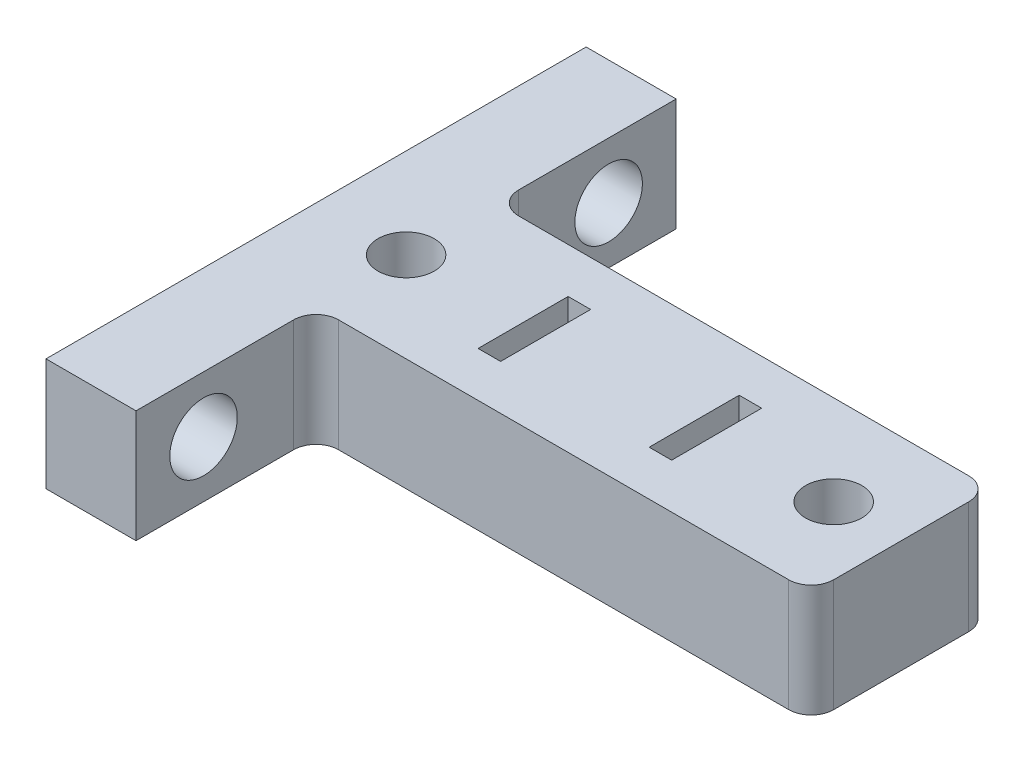
ISO-10303-21;
HEADER;
FILE_DESCRIPTION(('STEP AP214'),'2;1');
FILE_NAME('part.step','',(''),(''),'','','');
FILE_SCHEMA(('AUTOMOTIVE_DESIGN { 1 0 10303 214 1 1 1 1 }'));
ENDSEC;
DATA;
#1=APPLICATION_CONTEXT('core data for automotive mechanical design processes');
#2=APPLICATION_PROTOCOL_DEFINITION('international standard','automotive_design',2000,#1);
#3=PRODUCT_CONTEXT('',#1,'mechanical');
#4=PRODUCT('Part','Part','',(#3));
#5=PRODUCT_RELATED_PRODUCT_CATEGORY('part','',(#4));
#6=PRODUCT_DEFINITION_FORMATION('','',#4);
#7=PRODUCT_DEFINITION_CONTEXT('part definition',#1,'design');
#8=PRODUCT_DEFINITION('design','',#6,#7);
#9=PRODUCT_DEFINITION_SHAPE('','',#8);
#10=(LENGTH_UNIT() NAMED_UNIT(*) SI_UNIT(.MILLI.,.METRE.));
#11=(NAMED_UNIT(*) PLANE_ANGLE_UNIT() SI_UNIT($,.RADIAN.));
#12=(NAMED_UNIT(*) SI_UNIT($,.STERADIAN.) SOLID_ANGLE_UNIT());
#13=UNCERTAINTY_MEASURE_WITH_UNIT(LENGTH_MEASURE(1.E-05),#10,'distance_accuracy_value','');
#14=(GEOMETRIC_REPRESENTATION_CONTEXT(3) GLOBAL_UNCERTAINTY_ASSIGNED_CONTEXT((#13)) GLOBAL_UNIT_ASSIGNED_CONTEXT((#10,
#11,#12)) REPRESENTATION_CONTEXT('',''));
#15=CARTESIAN_POINT('',(0.,0.,0.));
#16=DIRECTION('',(0.,0.,1.));
#17=DIRECTION('',(1.,0.,0.));
#18=AXIS2_PLACEMENT_3D('',#15,#16,#17);
#19=CARTESIAN_POINT('',(-8.,5.,-5.));
#20=DIRECTION('',(0.,1.,0.));
#21=DIRECTION('',(0.,0.,1.));
#22=AXIS2_PLACEMENT_3D('',#19,#20,#21);
#23=PLANE('',#22);
#24=CARTESIAN_POINT('',(10.,5.,0.));
#25=DIRECTION('',(0.,1.,0.));
#26=DIRECTION('',(0.,0.,1.));
#27=AXIS2_PLACEMENT_3D('',#24,#25,#26);
#28=CIRCLE('',#27,1.25);
#29=CARTESIAN_POINT('',(10.,5.,1.25));
#30=VERTEX_POINT('',#29);
#31=EDGE_CURVE('E245',#30,#30,#28,.T.);
#32=ORIENTED_EDGE('',*,*,#31,.F.);
#33=EDGE_LOOP('',(#32));
#34=FACE_BOUND('',#33,.T.);
#35=DIRECTION('',(0.,0.,1.));
#36=VECTOR('',#35,1.);
#37=CARTESIAN_POINT('',(-13.,5.,-4.));
#38=LINE('',#37,#36);
#39=CARTESIAN_POINT('',(-13.,5.,-12.));
#40=VERTEX_POINT('',#39);
#41=CARTESIAN_POINT('',(-13.,5.,12.));
#42=VERTEX_POINT('',#41);
#43=EDGE_CURVE('E251',#40,#42,#38,.T.);
#44=ORIENTED_EDGE('',*,*,#43,.T.);
#45=DIRECTION('',(1.,0.,0.));
#46=VECTOR('',#45,1.);
#47=CARTESIAN_POINT('',(-13.,5.,12.));
#48=LINE('',#47,#46);
#49=CARTESIAN_POINT('',(-9.,5.,12.));
#50=VERTEX_POINT('',#49);
#51=EDGE_CURVE('E253',#42,#50,#48,.T.);
#52=ORIENTED_EDGE('',*,*,#51,.T.);
#53=DIRECTION('',(0.,0.,-1.));
#54=VECTOR('',#53,1.);
#55=CARTESIAN_POINT('',(-9.,5.,12.));
#56=LINE('',#55,#54);
#57=CARTESIAN_POINT('',(-9.,5.,5.));
#58=VERTEX_POINT('',#57);
#59=EDGE_CURVE('E256',#50,#58,#56,.T.);
#60=ORIENTED_EDGE('',*,*,#59,.T.);
#61=CARTESIAN_POINT('',(-8.,5.,5.));
#62=DIRECTION('',(0.,-1.,0.));
#63=DIRECTION('',(0.,0.,-1.));
#64=AXIS2_PLACEMENT_3D('',#61,#62,#63);
#65=CIRCLE('',#64,1.);
#66=CARTESIAN_POINT('',(-8.,5.,4.));
#67=VERTEX_POINT('',#66);
#68=EDGE_CURVE('E258',#58,#67,#65,.T.);
#69=ORIENTED_EDGE('',*,*,#68,.T.);
#70=DIRECTION('',(1.,0.,0.));
#71=VECTOR('',#70,1.);
#72=CARTESIAN_POINT('',(-8.,5.,4.));
#73=LINE('',#72,#71);
#74=CARTESIAN_POINT('',(12.,5.,4.));
#75=VERTEX_POINT('',#74);
#76=EDGE_CURVE('E260',#67,#75,#73,.T.);
#77=ORIENTED_EDGE('',*,*,#76,.T.);
#78=CARTESIAN_POINT('',(12.,5.,3.));
#79=DIRECTION('',(0.,1.,0.));
#80=DIRECTION('',(0.,0.,1.));
#81=AXIS2_PLACEMENT_3D('',#78,#79,#80);
#82=CIRCLE('',#81,1.);
#83=CARTESIAN_POINT('',(13.,5.,3.));
#84=VERTEX_POINT('',#83);
#85=EDGE_CURVE('E262',#75,#84,#82,.T.);
#86=ORIENTED_EDGE('',*,*,#85,.T.);
#87=DIRECTION('',(0.,0.,-1.));
#88=VECTOR('',#87,1.);
#89=CARTESIAN_POINT('',(13.,5.,-3.));
#90=LINE('',#89,#88);
#91=CARTESIAN_POINT('',(13.,5.,-3.));
#92=VERTEX_POINT('',#91);
#93=EDGE_CURVE('E264',#84,#92,#90,.T.);
#94=ORIENTED_EDGE('',*,*,#93,.T.);
#95=CARTESIAN_POINT('',(12.,5.,-3.));
#96=DIRECTION('',(0.,1.,0.));
#97=DIRECTION('',(0.,0.,1.));
#98=AXIS2_PLACEMENT_3D('',#95,#96,#97);
#99=CIRCLE('',#98,0.999999999999999);
#100=CARTESIAN_POINT('',(12.,5.,-4.));
#101=VERTEX_POINT('',#100);
#102=EDGE_CURVE('E266',#92,#101,#99,.T.);
#103=ORIENTED_EDGE('',*,*,#102,.T.);
#104=DIRECTION('',(-1.,0.,0.));
#105=VECTOR('',#104,1.);
#106=CARTESIAN_POINT('',(-8.,5.,-4.));
#107=LINE('',#106,#105);
#108=CARTESIAN_POINT('',(-8.,5.,-4.));
#109=VERTEX_POINT('',#108);
#110=EDGE_CURVE('E268',#101,#109,#107,.T.);
#111=ORIENTED_EDGE('',*,*,#110,.T.);
#112=CARTESIAN_POINT('',(-8.,5.,-5.));
#113=DIRECTION('',(0.,-1.,0.));
#114=DIRECTION('',(0.,0.,1.));
#115=AXIS2_PLACEMENT_3D('',#112,#113,#114);
#116=CIRCLE('',#115,0.999999999999999);
#117=CARTESIAN_POINT('',(-9.,5.,-5.));
#118=VERTEX_POINT('',#117);
#119=EDGE_CURVE('E270',#109,#118,#116,.T.);
#120=ORIENTED_EDGE('',*,*,#119,.T.);
#121=DIRECTION('',(0.,0.,-1.));
#122=VECTOR('',#121,1.);
#123=CARTESIAN_POINT('',(-9.,5.,-12.));
#124=LINE('',#123,#122);
#125=CARTESIAN_POINT('',(-9.,5.,-12.));
#126=VERTEX_POINT('',#125);
#127=EDGE_CURVE('E272',#118,#126,#124,.T.);
#128=ORIENTED_EDGE('',*,*,#127,.T.);
#129=DIRECTION('',(-1.,0.,0.));
#130=VECTOR('',#129,1.);
#131=CARTESIAN_POINT('',(-13.,5.,-12.));
#132=LINE('',#131,#130);
#133=EDGE_CURVE('E274',#126,#40,#132,.T.);
#134=ORIENTED_EDGE('',*,*,#133,.T.);
#135=EDGE_LOOP('',(#44,#52,#60,#69,#77,#86,#94,#103,#111,#120,#128,#134));
#136=FACE_BOUND('',#135,.T.);
#137=CARTESIAN_POINT('',(-9.,5.,0.));
#138=DIRECTION('',(0.,1.,0.));
#139=DIRECTION('',(0.,0.,1.));
#140=AXIS2_PLACEMENT_3D('',#137,#138,#139);
#141=CIRCLE('',#140,1.25);
#142=CARTESIAN_POINT('',(-9.,5.,1.25));
#143=VERTEX_POINT('',#142);
#144=EDGE_CURVE('E239',#143,#143,#141,.T.);
#145=ORIENTED_EDGE('',*,*,#144,.F.);
#146=EDGE_LOOP('',(#145));
#147=FACE_BOUND('',#146,.T.);
#148=DIRECTION('',(-1.,0.,0.));
#149=VECTOR('',#148,1.);
#150=CARTESIAN_POINT('',(4.8,5.,-2.));
#151=LINE('',#150,#149);
#152=CARTESIAN_POINT('',(4.8,5.,-2.));
#153=VERTEX_POINT('',#152);
#154=CARTESIAN_POINT('',(3.8,5.,-2.));
#155=VERTEX_POINT('',#154);
#156=EDGE_CURVE('E210',#153,#155,#151,.T.);
#157=ORIENTED_EDGE('',*,*,#156,.F.);
#158=DIRECTION('',(0.,0.,-1.));
#159=VECTOR('',#158,1.);
#160=CARTESIAN_POINT('',(4.8,5.,2.));
#161=LINE('',#160,#159);
#162=CARTESIAN_POINT('',(4.8,5.,2.));
#163=VERTEX_POINT('',#162);
#164=EDGE_CURVE('E208',#163,#153,#161,.T.);
#165=ORIENTED_EDGE('',*,*,#164,.F.);
#166=DIRECTION('',(1.,0.,0.));
#167=VECTOR('',#166,1.);
#168=CARTESIAN_POINT('',(4.8,5.,2.));
#169=LINE('',#168,#167);
#170=CARTESIAN_POINT('',(3.8,5.,2.));
#171=VERTEX_POINT('',#170);
#172=EDGE_CURVE('E216',#171,#163,#169,.T.);
#173=ORIENTED_EDGE('',*,*,#172,.F.);
#174=DIRECTION('',(0.,0.,1.));
#175=VECTOR('',#174,1.);
#176=CARTESIAN_POINT('',(3.8,5.,2.));
#177=LINE('',#176,#175);
#178=EDGE_CURVE('E213',#155,#171,#177,.T.);
#179=ORIENTED_EDGE('',*,*,#178,.F.);
#180=EDGE_LOOP('',(#157,#165,#173,#179));
#181=FACE_BOUND('',#180,.T.);
#182=DIRECTION('',(-1.,0.,0.));
#183=VECTOR('',#182,1.);
#184=CARTESIAN_POINT('',(-2.8,5.,-2.));
#185=LINE('',#184,#183);
#186=CARTESIAN_POINT('',(-2.8,5.,-2.));
#187=VERTEX_POINT('',#186);
#188=CARTESIAN_POINT('',(-3.8,5.,-2.));
#189=VERTEX_POINT('',#188);
#190=EDGE_CURVE('E178',#187,#189,#185,.T.);
#191=ORIENTED_EDGE('',*,*,#190,.F.);
#192=DIRECTION('',(0.,0.,-1.));
#193=VECTOR('',#192,1.);
#194=CARTESIAN_POINT('',(-2.8,5.,2.));
#195=LINE('',#194,#193);
#196=CARTESIAN_POINT('',(-2.8,5.,2.));
#197=VERTEX_POINT('',#196);
#198=EDGE_CURVE('E170',#197,#187,#195,.T.);
#199=ORIENTED_EDGE('',*,*,#198,.F.);
#200=DIRECTION('',(1.,0.,0.));
#201=VECTOR('',#200,1.);
#202=CARTESIAN_POINT('',(-2.8,5.,2.));
#203=LINE('',#202,#201);
#204=CARTESIAN_POINT('',(-3.8,5.,2.));
#205=VERTEX_POINT('',#204);
#206=EDGE_CURVE('E192',#205,#197,#203,.T.);
#207=ORIENTED_EDGE('',*,*,#206,.F.);
#208=DIRECTION('',(0.,0.,1.));
#209=VECTOR('',#208,1.);
#210=CARTESIAN_POINT('',(-3.8,5.,2.));
#211=LINE('',#210,#209);
#212=EDGE_CURVE('E190',#189,#205,#211,.T.);
#213=ORIENTED_EDGE('',*,*,#212,.F.);
#214=EDGE_LOOP('',(#191,#199,#207,#213));
#215=FACE_BOUND('',#214,.T.);
#216=ADVANCED_FACE('F33',(#34,#136,#147,#181,#215),#23,.T.);
#217=CARTESIAN_POINT('',(-8.,0.,-5.));
#218=DIRECTION('',(0.,1.,0.));
#219=DIRECTION('',(0.,0.,1.));
#220=AXIS2_PLACEMENT_3D('',#217,#218,#219);
#221=PLANE('',#220);
#222=DIRECTION('',(0.,0.,-1.));
#223=VECTOR('',#222,1.);
#224=CARTESIAN_POINT('',(4.8,0.,2.));
#225=LINE('',#224,#223);
#226=CARTESIAN_POINT('',(4.8,0.,2.));
#227=VERTEX_POINT('',#226);
#228=CARTESIAN_POINT('',(4.8,0.,-2.));
#229=VERTEX_POINT('',#228);
#230=EDGE_CURVE('E186',#227,#229,#225,.T.);
#231=ORIENTED_EDGE('',*,*,#230,.T.);
#232=DIRECTION('',(-1.,0.,0.));
#233=VECTOR('',#232,1.);
#234=CARTESIAN_POINT('',(4.8,0.,-2.));
#235=LINE('',#234,#233);
#236=CARTESIAN_POINT('',(3.8,0.,-2.));
#237=VERTEX_POINT('',#236);
#238=EDGE_CURVE('E221',#229,#237,#235,.T.);
#239=ORIENTED_EDGE('',*,*,#238,.T.);
#240=DIRECTION('',(0.,0.,1.));
#241=VECTOR('',#240,1.);
#242=CARTESIAN_POINT('',(3.8,0.,2.));
#243=LINE('',#242,#241);
#244=CARTESIAN_POINT('',(3.8,0.,2.));
#245=VERTEX_POINT('',#244);
#246=EDGE_CURVE('E224',#237,#245,#243,.T.);
#247=ORIENTED_EDGE('',*,*,#246,.T.);
#248=DIRECTION('',(1.,0.,0.));
#249=VECTOR('',#248,1.);
#250=CARTESIAN_POINT('',(4.8,0.,2.));
#251=LINE('',#250,#249);
#252=EDGE_CURVE('E211',#245,#227,#251,.T.);
#253=ORIENTED_EDGE('',*,*,#252,.T.);
#254=EDGE_LOOP('',(#231,#239,#247,#253));
#255=FACE_BOUND('',#254,.T.);
#256=DIRECTION('',(0.,0.,1.));
#257=VECTOR('',#256,1.);
#258=CARTESIAN_POINT('',(-13.,0.,3.));
#259=LINE('',#258,#257);
#260=CARTESIAN_POINT('',(-13.,0.,-12.));
#261=VERTEX_POINT('',#260);
#262=CARTESIAN_POINT('',(-13.,0.,12.));
#263=VERTEX_POINT('',#262);
#264=EDGE_CURVE('E248',#261,#263,#259,.T.);
#265=ORIENTED_EDGE('',*,*,#264,.F.);
#266=DIRECTION('',(-1.,0.,0.));
#267=VECTOR('',#266,1.);
#268=CARTESIAN_POINT('',(-13.,0.,-12.));
#269=LINE('',#268,#267);
#270=CARTESIAN_POINT('',(-9.,0.,-12.));
#271=VERTEX_POINT('',#270);
#272=EDGE_CURVE('E254',#271,#261,#269,.T.);
#273=ORIENTED_EDGE('',*,*,#272,.F.);
#274=DIRECTION('',(0.,0.,-1.));
#275=VECTOR('',#274,1.);
#276=CARTESIAN_POINT('',(-9.,0.,-12.));
#277=LINE('',#276,#275);
#278=CARTESIAN_POINT('',(-9.,0.,-5.));
#279=VERTEX_POINT('',#278);
#280=EDGE_CURVE('E296',#279,#271,#277,.T.);
#281=ORIENTED_EDGE('',*,*,#280,.F.);
#282=CARTESIAN_POINT('',(-8.,0.,-5.));
#283=DIRECTION('',(0.,-1.,0.));
#284=DIRECTION('',(0.,0.,1.));
#285=AXIS2_PLACEMENT_3D('',#282,#283,#284);
#286=CIRCLE('',#285,0.999999999999999);
#287=CARTESIAN_POINT('',(-8.,0.,-4.));
#288=VERTEX_POINT('',#287);
#289=EDGE_CURVE('E294',#288,#279,#286,.T.);
#290=ORIENTED_EDGE('',*,*,#289,.F.);
#291=DIRECTION('',(-1.,0.,0.));
#292=VECTOR('',#291,1.);
#293=CARTESIAN_POINT('',(-8.,0.,-4.));
#294=LINE('',#293,#292);
#295=CARTESIAN_POINT('',(12.,0.,-4.));
#296=VERTEX_POINT('',#295);
#297=EDGE_CURVE('E292',#296,#288,#294,.T.);
#298=ORIENTED_EDGE('',*,*,#297,.F.);
#299=CARTESIAN_POINT('',(12.,0.,-3.));
#300=DIRECTION('',(0.,1.,0.));
#301=DIRECTION('',(0.,0.,1.));
#302=AXIS2_PLACEMENT_3D('',#299,#300,#301);
#303=CIRCLE('',#302,0.999999999999999);
#304=CARTESIAN_POINT('',(13.,0.,-3.));
#305=VERTEX_POINT('',#304);
#306=EDGE_CURVE('E290',#305,#296,#303,.T.);
#307=ORIENTED_EDGE('',*,*,#306,.F.);
#308=DIRECTION('',(0.,0.,-1.));
#309=VECTOR('',#308,1.);
#310=CARTESIAN_POINT('',(13.,0.,-3.));
#311=LINE('',#310,#309);
#312=CARTESIAN_POINT('',(13.,0.,3.));
#313=VERTEX_POINT('',#312);
#314=EDGE_CURVE('E288',#313,#305,#311,.T.);
#315=ORIENTED_EDGE('',*,*,#314,.F.);
#316=CARTESIAN_POINT('',(12.,0.,3.));
#317=DIRECTION('',(0.,1.,0.));
#318=DIRECTION('',(0.,0.,1.));
#319=AXIS2_PLACEMENT_3D('',#316,#317,#318);
#320=CIRCLE('',#319,1.);
#321=CARTESIAN_POINT('',(12.,0.,4.));
#322=VERTEX_POINT('',#321);
#323=EDGE_CURVE('E286',#322,#313,#320,.T.);
#324=ORIENTED_EDGE('',*,*,#323,.F.);
#325=DIRECTION('',(1.,0.,0.));
#326=VECTOR('',#325,1.);
#327=CARTESIAN_POINT('',(-8.,0.,4.));
#328=LINE('',#327,#326);
#329=CARTESIAN_POINT('',(-8.,0.,4.));
#330=VERTEX_POINT('',#329);
#331=EDGE_CURVE('E284',#330,#322,#328,.T.);
#332=ORIENTED_EDGE('',*,*,#331,.F.);
#333=CARTESIAN_POINT('',(-8.,0.,5.));
#334=DIRECTION('',(0.,-1.,0.));
#335=DIRECTION('',(0.,0.,-1.));
#336=AXIS2_PLACEMENT_3D('',#333,#334,#335);
#337=CIRCLE('',#336,1.);
#338=CARTESIAN_POINT('',(-9.,0.,5.));
#339=VERTEX_POINT('',#338);
#340=EDGE_CURVE('E282',#339,#330,#337,.T.);
#341=ORIENTED_EDGE('',*,*,#340,.F.);
#342=DIRECTION('',(0.,0.,-1.));
#343=VECTOR('',#342,1.);
#344=CARTESIAN_POINT('',(-9.,0.,12.));
#345=LINE('',#344,#343);
#346=CARTESIAN_POINT('',(-9.,0.,12.));
#347=VERTEX_POINT('',#346);
#348=EDGE_CURVE('E280',#347,#339,#345,.T.);
#349=ORIENTED_EDGE('',*,*,#348,.F.);
#350=DIRECTION('',(1.,0.,0.));
#351=VECTOR('',#350,1.);
#352=CARTESIAN_POINT('',(-13.,0.,12.));
#353=LINE('',#352,#351);
#354=EDGE_CURVE('E278',#263,#347,#353,.T.);
#355=ORIENTED_EDGE('',*,*,#354,.F.);
#356=EDGE_LOOP('',(#265,#273,#281,#290,#298,#307,#315,#324,#332,#341,#349,#355));
#357=FACE_BOUND('',#356,.T.);
#358=CARTESIAN_POINT('',(10.,0.,0.));
#359=DIRECTION('',(0.,1.,0.));
#360=DIRECTION('',(0.,0.,1.));
#361=AXIS2_PLACEMENT_3D('',#358,#359,#360);
#362=CIRCLE('',#361,1.25);
#363=CARTESIAN_POINT('',(10.,0.,1.25));
#364=VERTEX_POINT('',#363);
#365=EDGE_CURVE('E242',#364,#364,#362,.T.);
#366=ORIENTED_EDGE('',*,*,#365,.T.);
#367=EDGE_LOOP('',(#366));
#368=FACE_BOUND('',#367,.T.);
#369=CARTESIAN_POINT('',(-9.,0.,0.));
#370=DIRECTION('',(0.,1.,0.));
#371=DIRECTION('',(0.,0.,1.));
#372=AXIS2_PLACEMENT_3D('',#369,#370,#371);
#373=CIRCLE('',#372,1.25);
#374=CARTESIAN_POINT('',(-9.,0.,1.25));
#375=VERTEX_POINT('',#374);
#376=EDGE_CURVE('E238',#375,#375,#373,.T.);
#377=ORIENTED_EDGE('',*,*,#376,.T.);
#378=EDGE_LOOP('',(#377));
#379=FACE_BOUND('',#378,.T.);
#380=DIRECTION('',(0.,0.,-1.));
#381=VECTOR('',#380,1.);
#382=CARTESIAN_POINT('',(-2.8,0.,2.));
#383=LINE('',#382,#381);
#384=CARTESIAN_POINT('',(-2.8,0.,2.));
#385=VERTEX_POINT('',#384);
#386=CARTESIAN_POINT('',(-2.8,0.,-2.));
#387=VERTEX_POINT('',#386);
#388=EDGE_CURVE('E56',#385,#387,#383,.T.);
#389=ORIENTED_EDGE('',*,*,#388,.T.);
#390=DIRECTION('',(-1.,0.,0.));
#391=VECTOR('',#390,1.);
#392=CARTESIAN_POINT('',(-2.8,0.,-2.));
#393=LINE('',#392,#391);
#394=CARTESIAN_POINT('',(-3.8,0.,-2.));
#395=VERTEX_POINT('',#394);
#396=EDGE_CURVE('E185',#387,#395,#393,.T.);
#397=ORIENTED_EDGE('',*,*,#396,.T.);
#398=DIRECTION('',(0.,0.,1.));
#399=VECTOR('',#398,1.);
#400=CARTESIAN_POINT('',(-3.8,0.,2.));
#401=LINE('',#400,#399);
#402=CARTESIAN_POINT('',(-3.8,0.,2.));
#403=VERTEX_POINT('',#402);
#404=EDGE_CURVE('E200',#395,#403,#401,.T.);
#405=ORIENTED_EDGE('',*,*,#404,.T.);
#406=DIRECTION('',(1.,0.,0.));
#407=VECTOR('',#406,1.);
#408=CARTESIAN_POINT('',(-2.8,0.,2.));
#409=LINE('',#408,#407);
#410=EDGE_CURVE('E179',#403,#385,#409,.T.);
#411=ORIENTED_EDGE('',*,*,#410,.T.);
#412=EDGE_LOOP('',(#389,#397,#405,#411));
#413=FACE_BOUND('',#412,.T.);
#414=ADVANCED_FACE('F340',(#255,#357,#368,#379,#413),#221,.F.);
#415=CARTESIAN_POINT('',(-13.,5.,3.));
#416=DIRECTION('',(1.,0.,0.));
#417=DIRECTION('',(0.,0.,-1.));
#418=AXIS2_PLACEMENT_3D('',#415,#416,#417);
#419=PLANE('',#418);
#420=CARTESIAN_POINT('',(-13.,2.5,9.));
#421=DIRECTION('',(-1.,0.,0.));
#422=DIRECTION('',(0.,0.,1.));
#423=AXIS2_PLACEMENT_3D('',#420,#421,#422);
#424=CIRCLE('',#423,1.5);
#425=CARTESIAN_POINT('',(-13.,2.5,10.5));
#426=VERTEX_POINT('',#425);
#427=EDGE_CURVE('E632',#426,#426,#424,.T.);
#428=ORIENTED_EDGE('',*,*,#427,.F.);
#429=EDGE_LOOP('',(#428));
#430=FACE_BOUND('',#429,.T.);
#431=CARTESIAN_POINT('',(-13.,2.5,-9.));
#432=DIRECTION('',(-1.,0.,0.));
#433=DIRECTION('',(0.,0.,1.));
#434=AXIS2_PLACEMENT_3D('',#431,#432,#433);
#435=CIRCLE('',#434,1.5);
#436=CARTESIAN_POINT('',(-13.,2.5,-7.5));
#437=VERTEX_POINT('',#436);
#438=EDGE_CURVE('E635',#437,#437,#435,.T.);
#439=ORIENTED_EDGE('',*,*,#438,.F.);
#440=EDGE_LOOP('',(#439));
#441=FACE_BOUND('',#440,.T.);
#442=ORIENTED_EDGE('',*,*,#264,.T.);
#443=DIRECTION('',(0.,-1.,0.));
#444=VECTOR('',#443,1.);
#445=CARTESIAN_POINT('',(-13.,5.,12.));
#446=LINE('',#445,#444);
#447=EDGE_CURVE('E11',#42,#263,#446,.T.);
#448=ORIENTED_EDGE('',*,*,#447,.F.);
#449=ORIENTED_EDGE('',*,*,#43,.F.);
#450=DIRECTION('',(0.,-1.,0.));
#451=VECTOR('',#450,1.);
#452=CARTESIAN_POINT('',(-13.,5.,-12.));
#453=LINE('',#452,#451);
#454=EDGE_CURVE('E276',#40,#261,#453,.T.);
#455=ORIENTED_EDGE('',*,*,#454,.T.);
#456=EDGE_LOOP('',(#442,#448,#449,#455));
#457=FACE_BOUND('',#456,.T.);
#458=ADVANCED_FACE('F35',(#430,#441,#457),#419,.F.);
#459=CARTESIAN_POINT('',(-13.,5.,12.));
#460=DIRECTION('',(0.,0.,-1.));
#461=DIRECTION('',(-1.,0.,0.));
#462=AXIS2_PLACEMENT_3D('',#459,#460,#461);
#463=PLANE('',#462);
#464=ORIENTED_EDGE('',*,*,#354,.T.);
#465=DIRECTION('',(0.,-1.,0.));
#466=VECTOR('',#465,1.);
#467=CARTESIAN_POINT('',(-9.,5.,12.));
#468=LINE('',#467,#466);
#469=EDGE_CURVE('E41',#50,#347,#468,.T.);
#470=ORIENTED_EDGE('',*,*,#469,.F.);
#471=ORIENTED_EDGE('',*,*,#51,.F.);
#472=ORIENTED_EDGE('',*,*,#447,.T.);
#473=EDGE_LOOP('',(#464,#470,#471,#472));
#474=FACE_BOUND('',#473,.T.);
#475=ADVANCED_FACE('F358',(#474),#463,.F.);
#476=CARTESIAN_POINT('',(-9.,5.,12.));
#477=DIRECTION('',(-1.,0.,0.));
#478=DIRECTION('',(0.,0.,1.));
#479=AXIS2_PLACEMENT_3D('',#476,#477,#478);
#480=PLANE('',#479);
#481=CARTESIAN_POINT('',(-9.,2.5,9.));
#482=DIRECTION('',(-1.,0.,0.));
#483=DIRECTION('',(0.,0.,1.));
#484=AXIS2_PLACEMENT_3D('',#481,#482,#483);
#485=CIRCLE('',#484,1.5);
#486=CARTESIAN_POINT('',(-9.,2.5,10.5));
#487=VERTEX_POINT('',#486);
#488=EDGE_CURVE('E198',#487,#487,#485,.T.);
#489=ORIENTED_EDGE('',*,*,#488,.T.);
#490=EDGE_LOOP('',(#489));
#491=FACE_BOUND('',#490,.T.);
#492=ORIENTED_EDGE('',*,*,#348,.T.);
#493=DIRECTION('',(0.,-1.,0.));
#494=VECTOR('',#493,1.);
#495=CARTESIAN_POINT('',(-9.,5.,5.));
#496=LINE('',#495,#494);
#497=EDGE_CURVE('E326',#58,#339,#496,.T.);
#498=ORIENTED_EDGE('',*,*,#497,.F.);
#499=ORIENTED_EDGE('',*,*,#59,.F.);
#500=ORIENTED_EDGE('',*,*,#469,.T.);
#501=EDGE_LOOP('',(#492,#498,#499,#500));
#502=FACE_BOUND('',#501,.T.);
#503=ADVANCED_FACE('F333',(#491,#502),#480,.F.);
#504=CARTESIAN_POINT('',(-8.,5.,5.));
#505=DIRECTION('',(0.,-1.,0.));
#506=DIRECTION('',(0.,0.,-1.));
#507=AXIS2_PLACEMENT_3D('',#504,#505,#506);
#508=CYLINDRICAL_SURFACE('',#507,1.);
#509=ORIENTED_EDGE('',*,*,#340,.T.);
#510=DIRECTION('',(0.,-1.,0.));
#511=VECTOR('',#510,1.);
#512=CARTESIAN_POINT('',(-8.,5.,4.));
#513=LINE('',#512,#511);
#514=EDGE_CURVE('E323',#67,#330,#513,.T.);
#515=ORIENTED_EDGE('',*,*,#514,.F.);
#516=ORIENTED_EDGE('',*,*,#68,.F.);
#517=ORIENTED_EDGE('',*,*,#497,.T.);
#518=EDGE_LOOP('',(#509,#515,#516,#517));
#519=FACE_BOUND('',#518,.T.);
#520=ADVANCED_FACE('F346',(#519),#508,.F.);
#521=CARTESIAN_POINT('',(-8.,5.,4.));
#522=DIRECTION('',(0.,0.,-1.));
#523=DIRECTION('',(-1.,0.,0.));
#524=AXIS2_PLACEMENT_3D('',#521,#522,#523);
#525=PLANE('',#524);
#526=ORIENTED_EDGE('',*,*,#331,.T.);
#527=DIRECTION('',(0.,-1.,0.));
#528=VECTOR('',#527,1.);
#529=CARTESIAN_POINT('',(12.,5.,4.));
#530=LINE('',#529,#528);
#531=EDGE_CURVE('E320',#75,#322,#530,.T.);
#532=ORIENTED_EDGE('',*,*,#531,.F.);
#533=ORIENTED_EDGE('',*,*,#76,.F.);
#534=ORIENTED_EDGE('',*,*,#514,.T.);
#535=EDGE_LOOP('',(#526,#532,#533,#534));
#536=FACE_BOUND('',#535,.T.);
#537=ADVANCED_FACE('F350',(#536),#525,.F.);
#538=CARTESIAN_POINT('',(12.,5.,3.));
#539=DIRECTION('',(0.,-1.,0.));
#540=DIRECTION('',(0.,0.,-1.));
#541=AXIS2_PLACEMENT_3D('',#538,#539,#540);
#542=CYLINDRICAL_SURFACE('',#541,1.);
#543=ORIENTED_EDGE('',*,*,#323,.T.);
#544=DIRECTION('',(0.,-1.,0.));
#545=VECTOR('',#544,1.);
#546=CARTESIAN_POINT('',(13.,5.,3.));
#547=LINE('',#546,#545);
#548=EDGE_CURVE('E317',#84,#313,#547,.T.);
#549=ORIENTED_EDGE('',*,*,#548,.F.);
#550=ORIENTED_EDGE('',*,*,#85,.F.);
#551=ORIENTED_EDGE('',*,*,#531,.T.);
#552=EDGE_LOOP('',(#543,#549,#550,#551));
#553=FACE_BOUND('',#552,.T.);
#554=ADVANCED_FACE('F391',(#553),#542,.T.);
#555=CARTESIAN_POINT('',(13.,5.,-3.));
#556=DIRECTION('',(-1.,0.,0.));
#557=DIRECTION('',(0.,0.,1.));
#558=AXIS2_PLACEMENT_3D('',#555,#556,#557);
#559=PLANE('',#558);
#560=ORIENTED_EDGE('',*,*,#314,.T.);
#561=DIRECTION('',(0.,-1.,0.));
#562=VECTOR('',#561,1.);
#563=CARTESIAN_POINT('',(13.,5.,-3.));
#564=LINE('',#563,#562);
#565=EDGE_CURVE('E314',#92,#305,#564,.T.);
#566=ORIENTED_EDGE('',*,*,#565,.F.);
#567=ORIENTED_EDGE('',*,*,#93,.F.);
#568=ORIENTED_EDGE('',*,*,#548,.T.);
#569=EDGE_LOOP('',(#560,#566,#567,#568));
#570=FACE_BOUND('',#569,.T.);
#571=ADVANCED_FACE('F388',(#570),#559,.F.);
#572=CARTESIAN_POINT('',(12.,5.,-3.));
#573=DIRECTION('',(0.,-1.,0.));
#574=DIRECTION('',(0.,0.,-1.));
#575=AXIS2_PLACEMENT_3D('',#572,#573,#574);
#576=CYLINDRICAL_SURFACE('',#575,0.999999999999999);
#577=ORIENTED_EDGE('',*,*,#306,.T.);
#578=DIRECTION('',(0.,-1.,0.));
#579=VECTOR('',#578,1.);
#580=CARTESIAN_POINT('',(12.,5.,-4.));
#581=LINE('',#580,#579);
#582=EDGE_CURVE('E311',#101,#296,#581,.T.);
#583=ORIENTED_EDGE('',*,*,#582,.F.);
#584=ORIENTED_EDGE('',*,*,#102,.F.);
#585=ORIENTED_EDGE('',*,*,#565,.T.);
#586=EDGE_LOOP('',(#577,#583,#584,#585));
#587=FACE_BOUND('',#586,.T.);
#588=ADVANCED_FACE('F384',(#587),#576,.T.);
#589=CARTESIAN_POINT('',(-8.,5.,-4.));
#590=DIRECTION('',(0.,0.,1.));
#591=DIRECTION('',(1.,0.,0.));
#592=AXIS2_PLACEMENT_3D('',#589,#590,#591);
#593=PLANE('',#592);
#594=ORIENTED_EDGE('',*,*,#297,.T.);
#595=DIRECTION('',(0.,-1.,0.));
#596=VECTOR('',#595,1.);
#597=CARTESIAN_POINT('',(-8.,5.,-4.));
#598=LINE('',#597,#596);
#599=EDGE_CURVE('E308',#109,#288,#598,.T.);
#600=ORIENTED_EDGE('',*,*,#599,.F.);
#601=ORIENTED_EDGE('',*,*,#110,.F.);
#602=ORIENTED_EDGE('',*,*,#582,.T.);
#603=EDGE_LOOP('',(#594,#600,#601,#602));
#604=FACE_BOUND('',#603,.T.);
#605=ADVANCED_FACE('F380',(#604),#593,.F.);
#606=CARTESIAN_POINT('',(-8.,5.,-5.));
#607=DIRECTION('',(0.,-1.,0.));
#608=DIRECTION('',(0.,0.,-1.));
#609=AXIS2_PLACEMENT_3D('',#606,#607,#608);
#610=CYLINDRICAL_SURFACE('',#609,0.999999999999999);
#611=ORIENTED_EDGE('',*,*,#289,.T.);
#612=DIRECTION('',(0.,-1.,0.));
#613=VECTOR('',#612,1.);
#614=CARTESIAN_POINT('',(-9.,5.,-5.));
#615=LINE('',#614,#613);
#616=EDGE_CURVE('E305',#118,#279,#615,.T.);
#617=ORIENTED_EDGE('',*,*,#616,.F.);
#618=ORIENTED_EDGE('',*,*,#119,.F.);
#619=ORIENTED_EDGE('',*,*,#599,.T.);
#620=EDGE_LOOP('',(#611,#617,#618,#619));
#621=FACE_BOUND('',#620,.T.);
#622=ADVANCED_FACE('F375',(#621),#610,.F.);
#623=CARTESIAN_POINT('',(-9.,5.,-12.));
#624=DIRECTION('',(-1.,0.,0.));
#625=DIRECTION('',(0.,0.,1.));
#626=AXIS2_PLACEMENT_3D('',#623,#624,#625);
#627=PLANE('',#626);
#628=CARTESIAN_POINT('',(-9.,2.5,-9.));
#629=DIRECTION('',(-1.,0.,0.));
#630=DIRECTION('',(0.,0.,1.));
#631=AXIS2_PLACEMENT_3D('',#628,#629,#630);
#632=CIRCLE('',#631,1.5);
#633=CARTESIAN_POINT('',(-9.,2.5,-7.5));
#634=VERTEX_POINT('',#633);
#635=EDGE_CURVE('E637',#634,#634,#632,.T.);
#636=ORIENTED_EDGE('',*,*,#635,.T.);
#637=EDGE_LOOP('',(#636));
#638=FACE_BOUND('',#637,.T.);
#639=ORIENTED_EDGE('',*,*,#280,.T.);
#640=DIRECTION('',(0.,-1.,0.));
#641=VECTOR('',#640,1.);
#642=CARTESIAN_POINT('',(-9.,5.,-12.));
#643=LINE('',#642,#641);
#644=EDGE_CURVE('E302',#126,#271,#643,.T.);
#645=ORIENTED_EDGE('',*,*,#644,.F.);
#646=ORIENTED_EDGE('',*,*,#127,.F.);
#647=ORIENTED_EDGE('',*,*,#616,.T.);
#648=EDGE_LOOP('',(#639,#645,#646,#647));
#649=FACE_BOUND('',#648,.T.);
#650=ADVANCED_FACE('F369',(#638,#649),#627,.F.);
#651=CARTESIAN_POINT('',(-13.,5.,-12.));
#652=DIRECTION('',(0.,0.,1.));
#653=DIRECTION('',(1.,0.,0.));
#654=AXIS2_PLACEMENT_3D('',#651,#652,#653);
#655=PLANE('',#654);
#656=ORIENTED_EDGE('',*,*,#272,.T.);
#657=ORIENTED_EDGE('',*,*,#454,.F.);
#658=ORIENTED_EDGE('',*,*,#133,.F.);
#659=ORIENTED_EDGE('',*,*,#644,.T.);
#660=EDGE_LOOP('',(#656,#657,#658,#659));
#661=FACE_BOUND('',#660,.T.);
#662=ADVANCED_FACE('F364',(#661),#655,.F.);
#663=CARTESIAN_POINT('',(10.,5.,0.));
#664=DIRECTION('',(0.,-1.,0.));
#665=DIRECTION('',(0.,0.,-1.));
#666=AXIS2_PLACEMENT_3D('',#663,#664,#665);
#667=CYLINDRICAL_SURFACE('',#666,1.25);
#668=ORIENTED_EDGE('',*,*,#31,.T.);
#669=EDGE_LOOP('',(#668));
#670=FACE_BOUND('',#669,.T.);
#671=ORIENTED_EDGE('',*,*,#365,.F.);
#672=EDGE_LOOP('',(#671));
#673=FACE_BOUND('',#672,.T.);
#674=ADVANCED_FACE('F410',(#670,#673),#667,.F.);
#675=CARTESIAN_POINT('',(-9.,5.,0.));
#676=DIRECTION('',(0.,-1.,0.));
#677=DIRECTION('',(0.,0.,-1.));
#678=AXIS2_PLACEMENT_3D('',#675,#676,#677);
#679=CYLINDRICAL_SURFACE('',#678,1.25);
#680=ORIENTED_EDGE('',*,*,#144,.T.);
#681=EDGE_LOOP('',(#680));
#682=FACE_BOUND('',#681,.T.);
#683=ORIENTED_EDGE('',*,*,#376,.F.);
#684=EDGE_LOOP('',(#683));
#685=FACE_BOUND('',#684,.T.);
#686=ADVANCED_FACE('F451',(#682,#685),#679,.F.);
#687=CARTESIAN_POINT('',(4.8,5.,2.));
#688=DIRECTION('',(-1.,0.,0.));
#689=DIRECTION('',(0.,0.,1.));
#690=AXIS2_PLACEMENT_3D('',#687,#688,#689);
#691=PLANE('',#690);
#692=ORIENTED_EDGE('',*,*,#230,.F.);
#693=DIRECTION('',(0.,-1.,0.));
#694=VECTOR('',#693,1.);
#695=CARTESIAN_POINT('',(4.8,5.,2.));
#696=LINE('',#695,#694);
#697=EDGE_CURVE('E218',#163,#227,#696,.T.);
#698=ORIENTED_EDGE('',*,*,#697,.F.);
#699=ORIENTED_EDGE('',*,*,#164,.T.);
#700=DIRECTION('',(0.,-1.,0.));
#701=VECTOR('',#700,1.);
#702=CARTESIAN_POINT('',(4.8,5.,-2.));
#703=LINE('',#702,#701);
#704=EDGE_CURVE('E235',#153,#229,#703,.T.);
#705=ORIENTED_EDGE('',*,*,#704,.T.);
#706=EDGE_LOOP('',(#692,#698,#699,#705));
#707=FACE_BOUND('',#706,.T.);
#708=ADVANCED_FACE('F458',(#707),#691,.T.);
#709=CARTESIAN_POINT('',(4.8,5.,-2.));
#710=DIRECTION('',(0.,0.,1.));
#711=DIRECTION('',(1.,0.,0.));
#712=AXIS2_PLACEMENT_3D('',#709,#710,#711);
#713=PLANE('',#712);
#714=ORIENTED_EDGE('',*,*,#238,.F.);
#715=ORIENTED_EDGE('',*,*,#704,.F.);
#716=ORIENTED_EDGE('',*,*,#156,.T.);
#717=DIRECTION('',(0.,-1.,0.));
#718=VECTOR('',#717,1.);
#719=CARTESIAN_POINT('',(3.8,5.,-2.));
#720=LINE('',#719,#718);
#721=EDGE_CURVE('E233',#155,#237,#720,.T.);
#722=ORIENTED_EDGE('',*,*,#721,.T.);
#723=EDGE_LOOP('',(#714,#715,#716,#722));
#724=FACE_BOUND('',#723,.T.);
#725=ADVANCED_FACE('F465',(#724),#713,.T.);
#726=CARTESIAN_POINT('',(3.8,5.,2.));
#727=DIRECTION('',(1.,0.,0.));
#728=DIRECTION('',(0.,0.,-1.));
#729=AXIS2_PLACEMENT_3D('',#726,#727,#728);
#730=PLANE('',#729);
#731=ORIENTED_EDGE('',*,*,#246,.F.);
#732=ORIENTED_EDGE('',*,*,#721,.F.);
#733=ORIENTED_EDGE('',*,*,#178,.T.);
#734=DIRECTION('',(0.,-1.,0.));
#735=VECTOR('',#734,1.);
#736=CARTESIAN_POINT('',(3.8,5.,2.));
#737=LINE('',#736,#735);
#738=EDGE_CURVE('E231',#171,#245,#737,.T.);
#739=ORIENTED_EDGE('',*,*,#738,.T.);
#740=EDGE_LOOP('',(#731,#732,#733,#739));
#741=FACE_BOUND('',#740,.T.);
#742=ADVANCED_FACE('F473',(#741),#730,.T.);
#743=CARTESIAN_POINT('',(4.8,5.,2.));
#744=DIRECTION('',(0.,0.,-1.));
#745=DIRECTION('',(-1.,0.,0.));
#746=AXIS2_PLACEMENT_3D('',#743,#744,#745);
#747=PLANE('',#746);
#748=ORIENTED_EDGE('',*,*,#252,.F.);
#749=ORIENTED_EDGE('',*,*,#738,.F.);
#750=ORIENTED_EDGE('',*,*,#172,.T.);
#751=ORIENTED_EDGE('',*,*,#697,.T.);
#752=EDGE_LOOP('',(#748,#749,#750,#751));
#753=FACE_BOUND('',#752,.T.);
#754=ADVANCED_FACE('F481',(#753),#747,.T.);
#755=CARTESIAN_POINT('',(-2.8,5.,2.));
#756=DIRECTION('',(-1.,0.,0.));
#757=DIRECTION('',(0.,0.,1.));
#758=AXIS2_PLACEMENT_3D('',#755,#756,#757);
#759=PLANE('',#758);
#760=ORIENTED_EDGE('',*,*,#388,.F.);
#761=DIRECTION('',(0.,-1.,0.));
#762=VECTOR('',#761,1.);
#763=CARTESIAN_POINT('',(-2.8,5.,2.));
#764=LINE('',#763,#762);
#765=EDGE_CURVE('E174',#197,#385,#764,.T.);
#766=ORIENTED_EDGE('',*,*,#765,.F.);
#767=ORIENTED_EDGE('',*,*,#198,.T.);
#768=DIRECTION('',(0.,-1.,0.));
#769=VECTOR('',#768,1.);
#770=CARTESIAN_POINT('',(-2.8,5.,-2.));
#771=LINE('',#770,#769);
#772=EDGE_CURVE('E173',#187,#387,#771,.T.);
#773=ORIENTED_EDGE('',*,*,#772,.T.);
#774=EDGE_LOOP('',(#760,#766,#767,#773));
#775=FACE_BOUND('',#774,.T.);
#776=ADVANCED_FACE('F172',(#775),#759,.T.);
#777=CARTESIAN_POINT('',(-2.8,5.,-2.));
#778=DIRECTION('',(0.,0.,1.));
#779=DIRECTION('',(1.,0.,0.));
#780=AXIS2_PLACEMENT_3D('',#777,#778,#779);
#781=PLANE('',#780);
#782=ORIENTED_EDGE('',*,*,#396,.F.);
#783=ORIENTED_EDGE('',*,*,#772,.F.);
#784=ORIENTED_EDGE('',*,*,#190,.T.);
#785=DIRECTION('',(0.,-1.,0.));
#786=VECTOR('',#785,1.);
#787=CARTESIAN_POINT('',(-3.8,5.,-2.));
#788=LINE('',#787,#786);
#789=EDGE_CURVE('E187',#189,#395,#788,.T.);
#790=ORIENTED_EDGE('',*,*,#789,.T.);
#791=EDGE_LOOP('',(#782,#783,#784,#790));
#792=FACE_BOUND('',#791,.T.);
#793=ADVANCED_FACE('F182',(#792),#781,.T.);
#794=CARTESIAN_POINT('',(-3.8,5.,2.));
#795=DIRECTION('',(1.,0.,0.));
#796=DIRECTION('',(0.,0.,-1.));
#797=AXIS2_PLACEMENT_3D('',#794,#795,#796);
#798=PLANE('',#797);
#799=ORIENTED_EDGE('',*,*,#404,.F.);
#800=ORIENTED_EDGE('',*,*,#789,.F.);
#801=ORIENTED_EDGE('',*,*,#212,.T.);
#802=DIRECTION('',(0.,-1.,0.));
#803=VECTOR('',#802,1.);
#804=CARTESIAN_POINT('',(-3.8,5.,2.));
#805=LINE('',#804,#803);
#806=EDGE_CURVE('E48',#205,#403,#805,.T.);
#807=ORIENTED_EDGE('',*,*,#806,.T.);
#808=EDGE_LOOP('',(#799,#800,#801,#807));
#809=FACE_BOUND('',#808,.T.);
#810=ADVANCED_FACE('F502',(#809),#798,.T.);
#811=CARTESIAN_POINT('',(-2.8,5.,2.));
#812=DIRECTION('',(0.,0.,-1.));
#813=DIRECTION('',(-1.,0.,0.));
#814=AXIS2_PLACEMENT_3D('',#811,#812,#813);
#815=PLANE('',#814);
#816=ORIENTED_EDGE('',*,*,#410,.F.);
#817=ORIENTED_EDGE('',*,*,#806,.F.);
#818=ORIENTED_EDGE('',*,*,#206,.T.);
#819=ORIENTED_EDGE('',*,*,#765,.T.);
#820=EDGE_LOOP('',(#816,#817,#818,#819));
#821=FACE_BOUND('',#820,.T.);
#822=ADVANCED_FACE('F509',(#821),#815,.T.);
#823=CARTESIAN_POINT('',(-9.,2.5,-9.));
#824=DIRECTION('',(-1.,0.,0.));
#825=DIRECTION('',(0.,0.,1.));
#826=AXIS2_PLACEMENT_3D('',#823,#824,#825);
#827=CYLINDRICAL_SURFACE('',#826,1.5);
#828=ORIENTED_EDGE('',*,*,#635,.F.);
#829=EDGE_LOOP('',(#828));
#830=FACE_BOUND('',#829,.T.);
#831=ORIENTED_EDGE('',*,*,#438,.T.);
#832=EDGE_LOOP('',(#831));
#833=FACE_BOUND('',#832,.T.);
#834=ADVANCED_FACE('F517',(#830,#833),#827,.F.);
#835=CARTESIAN_POINT('',(-9.,2.5,9.));
#836=DIRECTION('',(-1.,0.,0.));
#837=DIRECTION('',(0.,0.,1.));
#838=AXIS2_PLACEMENT_3D('',#835,#836,#837);
#839=CYLINDRICAL_SURFACE('',#838,1.5);
#840=ORIENTED_EDGE('',*,*,#488,.F.);
#841=EDGE_LOOP('',(#840));
#842=FACE_BOUND('',#841,.T.);
#843=ORIENTED_EDGE('',*,*,#427,.T.);
#844=EDGE_LOOP('',(#843));
#845=FACE_BOUND('',#844,.T.);
#846=ADVANCED_FACE('F524',(#842,#845),#839,.F.);
#847=CLOSED_SHELL('',(#216,#414,#458,#475,#503,#520,#537,#554,#571,#588,#605,#622,#650,#662,
#674,#686,#708,#725,#742,#754,#776,#793,#810,#822,#834,#846));
#848=MANIFOLD_SOLID_BREP('B2',#847);
#849=ADVANCED_BREP_SHAPE_REPRESENTATION('',(#18,#848),#14);
#850=SHAPE_DEFINITION_REPRESENTATION(#9,#849);
ENDSEC;
END-ISO-10303-21;
